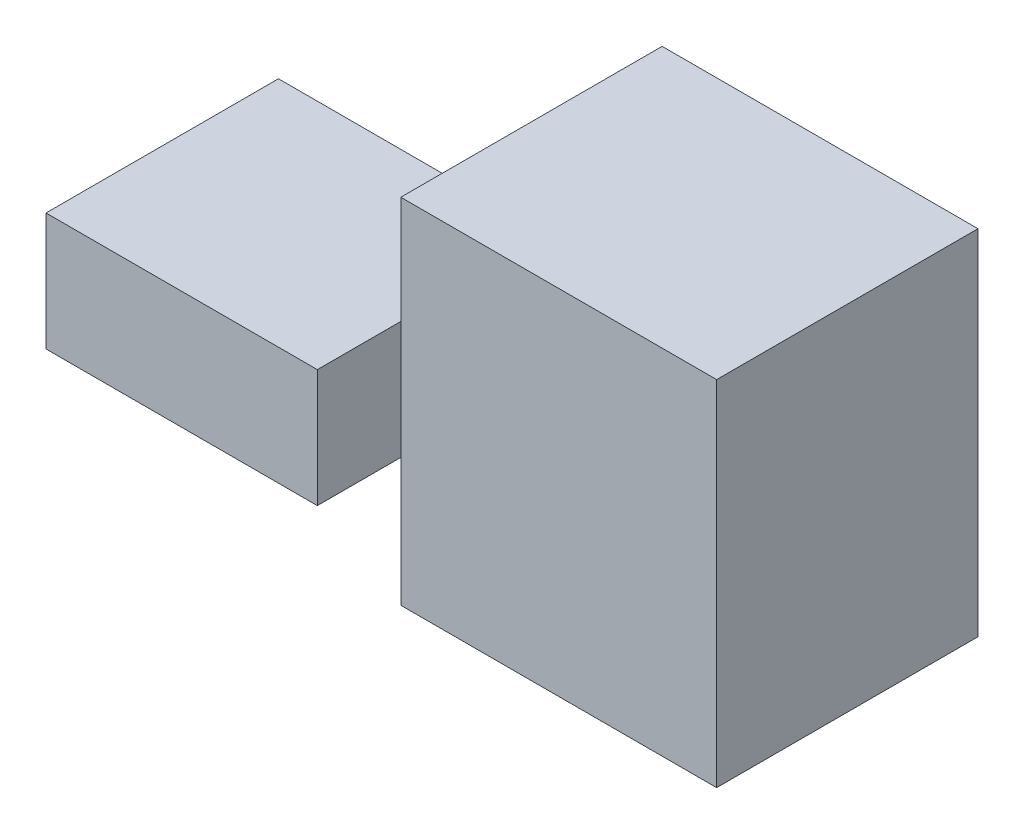
ISO-10303-21;
HEADER;
FILE_DESCRIPTION(('STEP AP214'),'2;1');
FILE_NAME('part.step','',(''),(''),'','','');
FILE_SCHEMA(('AUTOMOTIVE_DESIGN { 1 0 10303 214 1 1 1 1 }'));
ENDSEC;
DATA;
#1=APPLICATION_CONTEXT('core data for automotive mechanical design processes');
#2=APPLICATION_PROTOCOL_DEFINITION('international standard','automotive_design',2000,#1);
#3=PRODUCT_CONTEXT('',#1,'mechanical');
#4=PRODUCT('Part','Part','',(#3));
#5=PRODUCT_RELATED_PRODUCT_CATEGORY('part','',(#4));
#6=PRODUCT_DEFINITION_FORMATION('','',#4);
#7=PRODUCT_DEFINITION_CONTEXT('part definition',#1,'design');
#8=PRODUCT_DEFINITION('design','',#6,#7);
#9=PRODUCT_DEFINITION_SHAPE('','',#8);
#10=(LENGTH_UNIT() NAMED_UNIT(*) SI_UNIT(.MILLI.,.METRE.));
#11=(NAMED_UNIT(*) PLANE_ANGLE_UNIT() SI_UNIT($,.RADIAN.));
#12=(NAMED_UNIT(*) SI_UNIT($,.STERADIAN.) SOLID_ANGLE_UNIT());
#13=UNCERTAINTY_MEASURE_WITH_UNIT(LENGTH_MEASURE(1.E-05),#10,'distance_accuracy_value','');
#14=(GEOMETRIC_REPRESENTATION_CONTEXT(3) GLOBAL_UNCERTAINTY_ASSIGNED_CONTEXT((#13)) GLOBAL_UNIT_ASSIGNED_CONTEXT((#10,
#11,#12)) REPRESENTATION_CONTEXT('',''));
#15=CARTESIAN_POINT('',(0.,0.,0.));
#16=DIRECTION('',(0.,0.,1.));
#17=DIRECTION('',(1.,0.,0.));
#18=AXIS2_PLACEMENT_3D('',#15,#16,#17);
#19=CARTESIAN_POINT('',(38.1213191166694,150.,-49.5424226305659));
#20=DIRECTION('',(1.,0.,0.));
#21=DIRECTION('',(0.,0.,-1.));
#22=AXIS2_PLACEMENT_3D('',#19,#20,#21);
#23=PLANE('',#22);
#24=DIRECTION('',(0.,0.,1.));
#25=VECTOR('',#24,1.);
#26=CARTESIAN_POINT('',(38.1213191166694,0.,-49.5424226305659));
#27=LINE('',#26,#25);
#28=CARTESIAN_POINT('',(38.1213191166694,0.,-49.5424226305659));
#29=VERTEX_POINT('',#28);
#30=CARTESIAN_POINT('',(38.1213191166694,0.,61.3920946966573));
#31=VERTEX_POINT('',#30);
#32=EDGE_CURVE('E109',#29,#31,#27,.T.);
#33=ORIENTED_EDGE('',*,*,#32,.T.);
#34=DIRECTION('',(0.,-1.,0.));
#35=VECTOR('',#34,1.);
#36=CARTESIAN_POINT('',(38.1213191166694,150.,61.3920946966573));
#37=LINE('',#36,#35);
#38=CARTESIAN_POINT('',(38.1213191166694,150.,61.3920946966573));
#39=VERTEX_POINT('',#38);
#40=EDGE_CURVE('E12',#39,#31,#37,.T.);
#41=ORIENTED_EDGE('',*,*,#40,.F.);
#42=DIRECTION('',(0.,0.,1.));
#43=VECTOR('',#42,1.);
#44=CARTESIAN_POINT('',(38.1213191166694,150.,-49.5424226305659));
#45=LINE('',#44,#43);
#46=CARTESIAN_POINT('',(38.1213191166694,150.,-49.5424226305659));
#47=VERTEX_POINT('',#46);
#48=EDGE_CURVE('E97',#47,#39,#45,.T.);
#49=ORIENTED_EDGE('',*,*,#48,.F.);
#50=DIRECTION('',(0.,-1.,0.));
#51=VECTOR('',#50,1.);
#52=CARTESIAN_POINT('',(38.1213191166694,150.,-49.5424226305659));
#53=LINE('',#52,#51);
#54=EDGE_CURVE('E105',#47,#29,#53,.T.);
#55=ORIENTED_EDGE('',*,*,#54,.T.);
#56=EDGE_LOOP('',(#33,#41,#49,#55));
#57=FACE_BOUND('',#56,.T.);
#58=ADVANCED_FACE('F46',(#57),#23,.F.);
#59=CARTESIAN_POINT('',(38.1213191166694,150.,61.3920946966573));
#60=DIRECTION('',(0.,0.,-1.));
#61=DIRECTION('',(-1.,0.,0.));
#62=AXIS2_PLACEMENT_3D('',#59,#60,#61);
#63=PLANE('',#62);
#64=DIRECTION('',(1.,0.,0.));
#65=VECTOR('',#64,1.);
#66=CARTESIAN_POINT('',(38.1213191166694,0.,61.3920946966573));
#67=LINE('',#66,#65);
#68=CARTESIAN_POINT('',(172.195605357615,0.,61.3920946966573));
#69=VERTEX_POINT('',#68);
#70=EDGE_CURVE('E101',#31,#69,#67,.T.);
#71=ORIENTED_EDGE('',*,*,#70,.T.);
#72=DIRECTION('',(0.,-1.,0.));
#73=VECTOR('',#72,1.);
#74=CARTESIAN_POINT('',(172.195605357615,150.,61.3920946966573));
#75=LINE('',#74,#73);
#76=CARTESIAN_POINT('',(172.195605357615,150.,61.3920946966573));
#77=VERTEX_POINT('',#76);
#78=EDGE_CURVE('E54',#77,#69,#75,.T.);
#79=ORIENTED_EDGE('',*,*,#78,.F.);
#80=DIRECTION('',(1.,0.,0.));
#81=VECTOR('',#80,1.);
#82=CARTESIAN_POINT('',(38.1213191166694,150.,61.3920946966573));
#83=LINE('',#82,#81);
#84=EDGE_CURVE('E92',#39,#77,#83,.T.);
#85=ORIENTED_EDGE('',*,*,#84,.F.);
#86=ORIENTED_EDGE('',*,*,#40,.T.);
#87=EDGE_LOOP('',(#71,#79,#85,#86));
#88=FACE_BOUND('',#87,.T.);
#89=ADVANCED_FACE('F100',(#88),#63,.F.);
#90=CARTESIAN_POINT('',(172.195605357615,150.,-49.5424226305659));
#91=DIRECTION('',(-1.,0.,0.));
#92=DIRECTION('',(0.,0.,1.));
#93=AXIS2_PLACEMENT_3D('',#90,#91,#92);
#94=PLANE('',#93);
#95=DIRECTION('',(0.,0.,-1.));
#96=VECTOR('',#95,1.);
#97=CARTESIAN_POINT('',(172.195605357615,0.,-49.5424226305659));
#98=LINE('',#97,#96);
#99=CARTESIAN_POINT('',(172.195605357615,0.,-49.5424226305659));
#100=VERTEX_POINT('',#99);
#101=EDGE_CURVE('E79',#69,#100,#98,.T.);
#102=ORIENTED_EDGE('',*,*,#101,.T.);
#103=DIRECTION('',(0.,-1.,0.));
#104=VECTOR('',#103,1.);
#105=CARTESIAN_POINT('',(172.195605357615,150.,-49.5424226305659));
#106=LINE('',#105,#104);
#107=CARTESIAN_POINT('',(172.195605357615,150.,-49.5424226305659));
#108=VERTEX_POINT('',#107);
#109=EDGE_CURVE('E102',#108,#100,#106,.T.);
#110=ORIENTED_EDGE('',*,*,#109,.F.);
#111=DIRECTION('',(0.,0.,-1.));
#112=VECTOR('',#111,1.);
#113=CARTESIAN_POINT('',(172.195605357615,150.,-49.5424226305659));
#114=LINE('',#113,#112);
#115=EDGE_CURVE('E95',#77,#108,#114,.T.);
#116=ORIENTED_EDGE('',*,*,#115,.F.);
#117=ORIENTED_EDGE('',*,*,#78,.T.);
#118=EDGE_LOOP('',(#102,#110,#116,#117));
#119=FACE_BOUND('',#118,.T.);
#120=ADVANCED_FACE('F103',(#119),#94,.F.);
#121=CARTESIAN_POINT('',(38.1213191166694,150.,-49.5424226305659));
#122=DIRECTION('',(0.,0.,1.));
#123=DIRECTION('',(1.,0.,0.));
#124=AXIS2_PLACEMENT_3D('',#121,#122,#123);
#125=PLANE('',#124);
#126=DIRECTION('',(-1.,0.,0.));
#127=VECTOR('',#126,1.);
#128=CARTESIAN_POINT('',(38.1213191166694,0.,-49.5424226305659));
#129=LINE('',#128,#127);
#130=EDGE_CURVE('E85',#100,#29,#129,.T.);
#131=ORIENTED_EDGE('',*,*,#130,.T.);
#132=ORIENTED_EDGE('',*,*,#54,.F.);
#133=DIRECTION('',(-1.,0.,0.));
#134=VECTOR('',#133,1.);
#135=CARTESIAN_POINT('',(38.1213191166694,150.,-49.5424226305659));
#136=LINE('',#135,#134);
#137=EDGE_CURVE('E62',#108,#47,#136,.T.);
#138=ORIENTED_EDGE('',*,*,#137,.F.);
#139=ORIENTED_EDGE('',*,*,#109,.T.);
#140=EDGE_LOOP('',(#131,#132,#138,#139));
#141=FACE_BOUND('',#140,.T.);
#142=ADVANCED_FACE('F116',(#141),#125,.F.);
#143=CARTESIAN_POINT('',(0.,150.,0.));
#144=DIRECTION('',(0.,1.,0.));
#145=DIRECTION('',(0.,0.,1.));
#146=AXIS2_PLACEMENT_3D('',#143,#144,#145);
#147=PLANE('',#146);
#148=ORIENTED_EDGE('',*,*,#48,.T.);
#149=ORIENTED_EDGE('',*,*,#84,.T.);
#150=ORIENTED_EDGE('',*,*,#115,.T.);
#151=ORIENTED_EDGE('',*,*,#137,.T.);
#152=EDGE_LOOP('',(#148,#149,#150,#151));
#153=FACE_BOUND('',#152,.T.);
#154=ADVANCED_FACE('F93',(#153),#147,.T.);
#155=CARTESIAN_POINT('',(0.,0.,0.));
#156=DIRECTION('',(0.,1.,0.));
#157=DIRECTION('',(0.,0.,1.));
#158=AXIS2_PLACEMENT_3D('',#155,#156,#157);
#159=PLANE('',#158);
#160=ORIENTED_EDGE('',*,*,#32,.F.);
#161=ORIENTED_EDGE('',*,*,#130,.F.);
#162=ORIENTED_EDGE('',*,*,#101,.F.);
#163=ORIENTED_EDGE('',*,*,#70,.F.);
#164=EDGE_LOOP('',(#160,#161,#162,#163));
#165=FACE_BOUND('',#164,.T.);
#166=ADVANCED_FACE('F119',(#165),#159,.F.);
#167=CLOSED_SHELL('',(#58,#89,#120,#142,#154,#166));
#168=MANIFOLD_SOLID_BREP('B2',#167);
#169=CARTESIAN_POINT('',(-131.388204963452,50.,-56.2110625837363));
#170=DIRECTION('',(1.,0.,0.));
#171=DIRECTION('',(0.,0.,-1.));
#172=AXIS2_PLACEMENT_3D('',#169,#170,#171);
#173=PLANE('',#172);
#174=DIRECTION('',(0.,0.,1.));
#175=VECTOR('',#174,1.);
#176=CARTESIAN_POINT('',(-131.388204963452,0.,-56.2110625837363));
#177=LINE('',#176,#175);
#178=CARTESIAN_POINT('',(-131.388204963452,0.,-56.2110625837363));
#179=VERTEX_POINT('',#178);
#180=CARTESIAN_POINT('',(-131.388204963452,0.,42.4675264996932));
#181=VERTEX_POINT('',#180);
#182=EDGE_CURVE('E232',#179,#181,#177,.T.);
#183=ORIENTED_EDGE('',*,*,#182,.T.);
#184=DIRECTION('',(0.,-1.,0.));
#185=VECTOR('',#184,1.);
#186=CARTESIAN_POINT('',(-131.388204963452,50.,42.4675264996932));
#187=LINE('',#186,#185);
#188=CARTESIAN_POINT('',(-131.388204963452,50.,42.4675264996932));
#189=VERTEX_POINT('',#188);
#190=EDGE_CURVE('E44',#189,#181,#187,.T.);
#191=ORIENTED_EDGE('',*,*,#190,.F.);
#192=DIRECTION('',(0.,0.,1.));
#193=VECTOR('',#192,1.);
#194=CARTESIAN_POINT('',(-131.388204963452,50.,-56.2110625837363));
#195=LINE('',#194,#193);
#196=CARTESIAN_POINT('',(-131.388204963452,50.,-56.2110625837363));
#197=VERTEX_POINT('',#196);
#198=EDGE_CURVE('E220',#197,#189,#195,.T.);
#199=ORIENTED_EDGE('',*,*,#198,.F.);
#200=DIRECTION('',(0.,-1.,0.));
#201=VECTOR('',#200,1.);
#202=CARTESIAN_POINT('',(-131.388204963452,50.,-56.2110625837363));
#203=LINE('',#202,#201);
#204=EDGE_CURVE('E228',#197,#179,#203,.T.);
#205=ORIENTED_EDGE('',*,*,#204,.T.);
#206=EDGE_LOOP('',(#183,#191,#199,#205));
#207=FACE_BOUND('',#206,.T.);
#208=ADVANCED_FACE('F169',(#207),#173,.F.);
#209=CARTESIAN_POINT('',(-131.388204963452,50.,42.4675264996932));
#210=DIRECTION('',(0.,0.,-1.));
#211=DIRECTION('',(-1.,0.,0.));
#212=AXIS2_PLACEMENT_3D('',#209,#210,#211);
#213=PLANE('',#212);
#214=DIRECTION('',(1.,0.,0.));
#215=VECTOR('',#214,1.);
#216=CARTESIAN_POINT('',(-131.388204963452,0.,42.4675264996932));
#217=LINE('',#216,#215);
#218=CARTESIAN_POINT('',(-16.2173725791709,0.,42.4675264996932));
#219=VERTEX_POINT('',#218);
#220=EDGE_CURVE('E224',#181,#219,#217,.T.);
#221=ORIENTED_EDGE('',*,*,#220,.T.);
#222=DIRECTION('',(0.,-1.,0.));
#223=VECTOR('',#222,1.);
#224=CARTESIAN_POINT('',(-16.2173725791709,50.,42.4675264996932));
#225=LINE('',#224,#223);
#226=CARTESIAN_POINT('',(-16.2173725791709,50.,42.4675264996932));
#227=VERTEX_POINT('',#226);
#228=EDGE_CURVE('E177',#227,#219,#225,.T.);
#229=ORIENTED_EDGE('',*,*,#228,.F.);
#230=DIRECTION('',(1.,0.,0.));
#231=VECTOR('',#230,1.);
#232=CARTESIAN_POINT('',(-131.388204963452,50.,42.4675264996932));
#233=LINE('',#232,#231);
#234=EDGE_CURVE('E215',#189,#227,#233,.T.);
#235=ORIENTED_EDGE('',*,*,#234,.F.);
#236=ORIENTED_EDGE('',*,*,#190,.T.);
#237=EDGE_LOOP('',(#221,#229,#235,#236));
#238=FACE_BOUND('',#237,.T.);
#239=ADVANCED_FACE('F223',(#238),#213,.F.);
#240=CARTESIAN_POINT('',(-16.2173725791709,50.,-56.2110625837363));
#241=DIRECTION('',(-1.,0.,0.));
#242=DIRECTION('',(0.,0.,1.));
#243=AXIS2_PLACEMENT_3D('',#240,#241,#242);
#244=PLANE('',#243);
#245=DIRECTION('',(0.,0.,-1.));
#246=VECTOR('',#245,1.);
#247=CARTESIAN_POINT('',(-16.2173725791709,0.,-56.2110625837363));
#248=LINE('',#247,#246);
#249=CARTESIAN_POINT('',(-16.2173725791709,0.,-56.2110625837363));
#250=VERTEX_POINT('',#249);
#251=EDGE_CURVE('E202',#219,#250,#248,.T.);
#252=ORIENTED_EDGE('',*,*,#251,.T.);
#253=DIRECTION('',(0.,-1.,0.));
#254=VECTOR('',#253,1.);
#255=CARTESIAN_POINT('',(-16.2173725791709,50.,-56.2110625837363));
#256=LINE('',#255,#254);
#257=CARTESIAN_POINT('',(-16.2173725791709,50.,-56.2110625837363));
#258=VERTEX_POINT('',#257);
#259=EDGE_CURVE('E225',#258,#250,#256,.T.);
#260=ORIENTED_EDGE('',*,*,#259,.F.);
#261=DIRECTION('',(0.,0.,-1.));
#262=VECTOR('',#261,1.);
#263=CARTESIAN_POINT('',(-16.2173725791709,50.,-56.2110625837363));
#264=LINE('',#263,#262);
#265=EDGE_CURVE('E218',#227,#258,#264,.T.);
#266=ORIENTED_EDGE('',*,*,#265,.F.);
#267=ORIENTED_EDGE('',*,*,#228,.T.);
#268=EDGE_LOOP('',(#252,#260,#266,#267));
#269=FACE_BOUND('',#268,.T.);
#270=ADVANCED_FACE('F226',(#269),#244,.F.);
#271=CARTESIAN_POINT('',(-131.388204963452,50.,-56.2110625837363));
#272=DIRECTION('',(0.,0.,1.));
#273=DIRECTION('',(1.,0.,0.));
#274=AXIS2_PLACEMENT_3D('',#271,#272,#273);
#275=PLANE('',#274);
#276=DIRECTION('',(-1.,0.,0.));
#277=VECTOR('',#276,1.);
#278=CARTESIAN_POINT('',(-131.388204963452,0.,-56.2110625837363));
#279=LINE('',#278,#277);
#280=EDGE_CURVE('E208',#250,#179,#279,.T.);
#281=ORIENTED_EDGE('',*,*,#280,.T.);
#282=ORIENTED_EDGE('',*,*,#204,.F.);
#283=DIRECTION('',(-1.,0.,0.));
#284=VECTOR('',#283,1.);
#285=CARTESIAN_POINT('',(-131.388204963452,50.,-56.2110625837363));
#286=LINE('',#285,#284);
#287=EDGE_CURVE('E185',#258,#197,#286,.T.);
#288=ORIENTED_EDGE('',*,*,#287,.F.);
#289=ORIENTED_EDGE('',*,*,#259,.T.);
#290=EDGE_LOOP('',(#281,#282,#288,#289));
#291=FACE_BOUND('',#290,.T.);
#292=ADVANCED_FACE('F239',(#291),#275,.F.);
#293=CARTESIAN_POINT('',(-131.388204963452,50.,42.4675264996932));
#294=DIRECTION('',(0.,1.,0.));
#295=DIRECTION('',(0.,0.,1.));
#296=AXIS2_PLACEMENT_3D('',#293,#294,#295);
#297=PLANE('',#296);
#298=ORIENTED_EDGE('',*,*,#198,.T.);
#299=ORIENTED_EDGE('',*,*,#234,.T.);
#300=ORIENTED_EDGE('',*,*,#265,.T.);
#301=ORIENTED_EDGE('',*,*,#287,.T.);
#302=EDGE_LOOP('',(#298,#299,#300,#301));
#303=FACE_BOUND('',#302,.T.);
#304=ADVANCED_FACE('F216',(#303),#297,.T.);
#305=CARTESIAN_POINT('',(-131.388204963452,0.,42.4675264996932));
#306=DIRECTION('',(0.,1.,0.));
#307=DIRECTION('',(0.,0.,1.));
#308=AXIS2_PLACEMENT_3D('',#305,#306,#307);
#309=PLANE('',#308);
#310=ORIENTED_EDGE('',*,*,#182,.F.);
#311=ORIENTED_EDGE('',*,*,#280,.F.);
#312=ORIENTED_EDGE('',*,*,#251,.F.);
#313=ORIENTED_EDGE('',*,*,#220,.F.);
#314=EDGE_LOOP('',(#310,#311,#312,#313));
#315=FACE_BOUND('',#314,.T.);
#316=ADVANCED_FACE('F242',(#315),#309,.F.);
#317=CLOSED_SHELL('',(#208,#239,#270,#292,#304,#316));
#318=MANIFOLD_SOLID_BREP('B6',#317);
#319=ADVANCED_BREP_SHAPE_REPRESENTATION('',(#18,#168,#318),#14);
#320=SHAPE_DEFINITION_REPRESENTATION(#9,#319);
ENDSEC;
END-ISO-10303-21;
